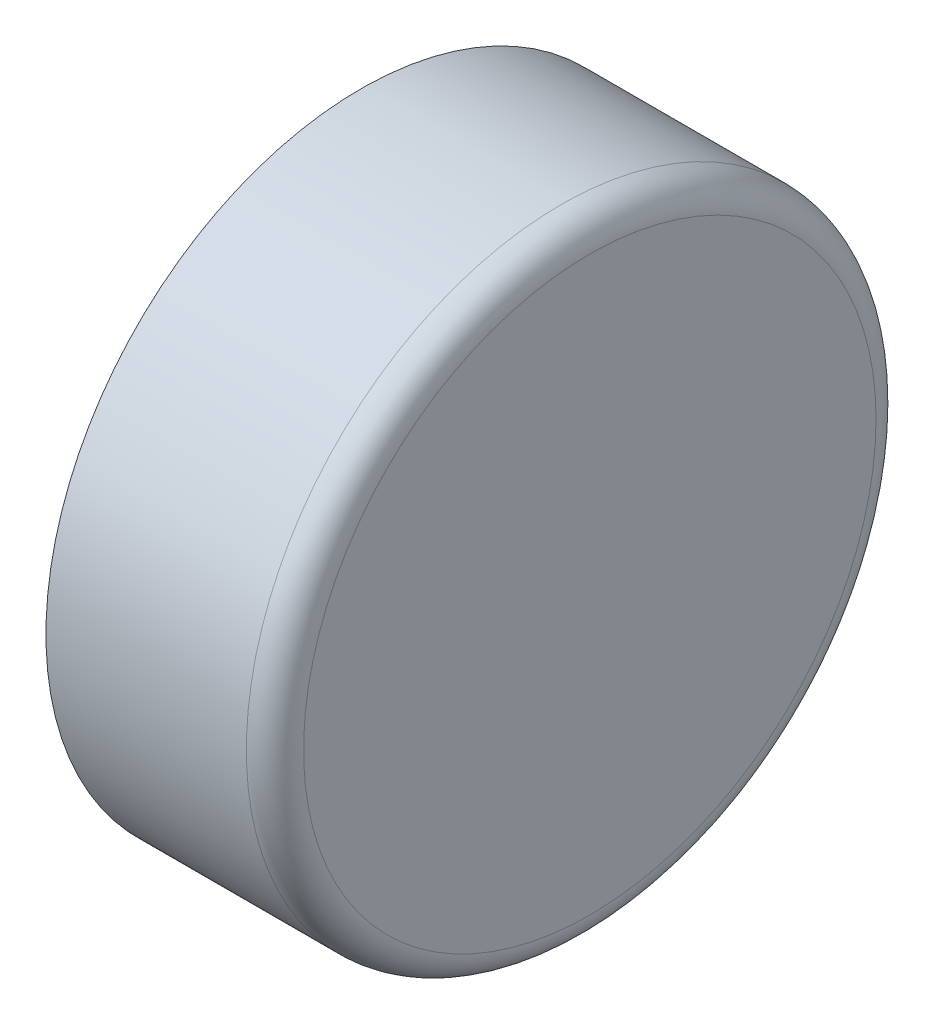
ISO-10303-21;
HEADER;
FILE_DESCRIPTION(('STEP AP214'),'2;1');
FILE_NAME('part.step','',(''),(''),'','','');
FILE_SCHEMA(('AUTOMOTIVE_DESIGN { 1 0 10303 214 1 1 1 1 }'));
ENDSEC;
DATA;
#1=APPLICATION_CONTEXT('core data for automotive mechanical design processes');
#2=APPLICATION_PROTOCOL_DEFINITION('international standard','automotive_design',2000,#1);
#3=PRODUCT_CONTEXT('',#1,'mechanical');
#4=PRODUCT('Part','Part','',(#3));
#5=PRODUCT_RELATED_PRODUCT_CATEGORY('part','',(#4));
#6=PRODUCT_DEFINITION_FORMATION('','',#4);
#7=PRODUCT_DEFINITION_CONTEXT('part definition',#1,'design');
#8=PRODUCT_DEFINITION('design','',#6,#7);
#9=PRODUCT_DEFINITION_SHAPE('','',#8);
#10=(LENGTH_UNIT() NAMED_UNIT(*) SI_UNIT(.MILLI.,.METRE.));
#11=(NAMED_UNIT(*) PLANE_ANGLE_UNIT() SI_UNIT($,.RADIAN.));
#12=(NAMED_UNIT(*) SI_UNIT($,.STERADIAN.) SOLID_ANGLE_UNIT());
#13=UNCERTAINTY_MEASURE_WITH_UNIT(LENGTH_MEASURE(1.E-05),#10,'distance_accuracy_value','');
#14=(GEOMETRIC_REPRESENTATION_CONTEXT(3) GLOBAL_UNCERTAINTY_ASSIGNED_CONTEXT((#13)) GLOBAL_UNIT_ASSIGNED_CONTEXT((#10,
#11,#12)) REPRESENTATION_CONTEXT('',''));
#15=CARTESIAN_POINT('',(0.,0.,0.));
#16=DIRECTION('',(0.,0.,1.));
#17=DIRECTION('',(1.,0.,0.));
#18=AXIS2_PLACEMENT_3D('',#15,#16,#17);
#19=CARTESIAN_POINT('',(8.,0.,0.));
#20=DIRECTION('',(-1.,0.,0.));
#21=DIRECTION('',(0.,0.,1.));
#22=AXIS2_PLACEMENT_3D('',#19,#20,#21);
#23=CYLINDRICAL_SURFACE('',#22,11.);
#24=CARTESIAN_POINT('',(7.,0.,0.));
#25=DIRECTION('',(1.,0.,0.));
#26=DIRECTION('',(0.,0.,-1.));
#27=AXIS2_PLACEMENT_3D('',#24,#25,#26);
#28=CIRCLE('',#27,11.);
#29=CARTESIAN_POINT('',(7.,0.,-11.));
#30=VERTEX_POINT('',#29);
#31=EDGE_CURVE('E11',#30,#30,#28,.F.);
#32=ORIENTED_EDGE('',*,*,#31,.T.);
#33=EDGE_LOOP('',(#32));
#34=FACE_BOUND('',#33,.T.);
#35=CARTESIAN_POINT('',(0.,0.,0.));
#36=DIRECTION('',(1.,0.,0.));
#37=DIRECTION('',(0.,0.,-1.));
#38=AXIS2_PLACEMENT_3D('',#35,#36,#37);
#39=CIRCLE('',#38,11.);
#40=CARTESIAN_POINT('',(0.,0.,-11.));
#41=VERTEX_POINT('',#40);
#42=EDGE_CURVE('E43',#41,#41,#39,.T.);
#43=ORIENTED_EDGE('',*,*,#42,.T.);
#44=EDGE_LOOP('',(#43));
#45=FACE_BOUND('',#44,.T.);
#46=ADVANCED_FACE('F32',(#34,#45),#23,.T.);
#47=CARTESIAN_POINT('',(8.,0.,0.));
#48=DIRECTION('',(1.,0.,0.));
#49=DIRECTION('',(0.,0.,-1.));
#50=AXIS2_PLACEMENT_3D('',#47,#48,#49);
#51=PLANE('',#50);
#52=CARTESIAN_POINT('',(8.,0.,0.));
#53=DIRECTION('',(1.,0.,0.));
#54=DIRECTION('',(0.,0.,-1.));
#55=AXIS2_PLACEMENT_3D('',#52,#53,#54);
#56=CIRCLE('',#55,10.);
#57=CARTESIAN_POINT('',(8.,0.,-10.));
#58=VERTEX_POINT('',#57);
#59=EDGE_CURVE('E39',#58,#58,#56,.T.);
#60=ORIENTED_EDGE('',*,*,#59,.T.);
#61=EDGE_LOOP('',(#60));
#62=FACE_BOUND('',#61,.T.);
#63=ADVANCED_FACE('F63',(#62),#51,.T.);
#64=CARTESIAN_POINT('',(0.,0.,0.));
#65=DIRECTION('',(1.,0.,0.));
#66=DIRECTION('',(0.,0.,-1.));
#67=AXIS2_PLACEMENT_3D('',#64,#65,#66);
#68=PLANE('',#67);
#69=CARTESIAN_POINT('',(0.,0.,0.));
#70=DIRECTION('',(-1.,0.,0.));
#71=DIRECTION('',(0.,0.,1.));
#72=AXIS2_PLACEMENT_3D('',#69,#70,#71);
#73=CIRCLE('',#72,3.);
#74=CARTESIAN_POINT('',(0.,0.,3.));
#75=VERTEX_POINT('',#74);
#76=EDGE_CURVE('E52',#75,#75,#73,.T.);
#77=ORIENTED_EDGE('',*,*,#76,.F.);
#78=EDGE_LOOP('',(#77));
#79=FACE_BOUND('',#78,.T.);
#80=ORIENTED_EDGE('',*,*,#42,.F.);
#81=EDGE_LOOP('',(#80));
#82=FACE_BOUND('',#81,.T.);
#83=ADVANCED_FACE('F59',(#79,#82),#68,.F.);
#84=CARTESIAN_POINT('',(7.,0.,0.));
#85=DIRECTION('',(1.,0.,0.));
#86=DIRECTION('',(0.,0.,-1.));
#87=AXIS2_PLACEMENT_3D('',#84,#85,#86);
#88=PLANE('',#87);
#89=CARTESIAN_POINT('',(7.,0.,0.));
#90=DIRECTION('',(1.,0.,0.));
#91=DIRECTION('',(0.,0.,-1.));
#92=AXIS2_PLACEMENT_3D('',#89,#90,#91);
#93=CIRCLE('',#92,3.);
#94=CARTESIAN_POINT('',(7.,0.,-3.));
#95=VERTEX_POINT('',#94);
#96=EDGE_CURVE('E47',#95,#95,#93,.F.);
#97=ORIENTED_EDGE('',*,*,#96,.T.);
#98=EDGE_LOOP('',(#97));
#99=FACE_BOUND('',#98,.T.);
#100=ADVANCED_FACE('F62',(#99),#88,.F.);
#101=CARTESIAN_POINT('',(16.4852813742386,0.,0.));
#102=DIRECTION('',(-1.,0.,0.));
#103=DIRECTION('',(0.,0.,1.));
#104=AXIS2_PLACEMENT_3D('',#101,#102,#103);
#105=CYLINDRICAL_SURFACE('',#104,3.);
#106=ORIENTED_EDGE('',*,*,#76,.T.);
#107=EDGE_LOOP('',(#106));
#108=FACE_BOUND('',#107,.T.);
#109=ORIENTED_EDGE('',*,*,#96,.F.);
#110=EDGE_LOOP('',(#109));
#111=FACE_BOUND('',#110,.T.);
#112=ADVANCED_FACE('F56',(#108,#111),#105,.F.);
#113=CARTESIAN_POINT('',(7.,0.,0.));
#114=DIRECTION('',(1.,0.,0.));
#115=DIRECTION('',(0.,0.,-1.));
#116=AXIS2_PLACEMENT_3D('',#113,#114,#115);
#117=TOROIDAL_SURFACE('',#116,10.,1.);
#118=ORIENTED_EDGE('',*,*,#31,.F.);
#119=EDGE_LOOP('',(#118));
#120=FACE_BOUND('',#119,.T.);
#121=ORIENTED_EDGE('',*,*,#59,.F.);
#122=EDGE_LOOP('',(#121));
#123=FACE_BOUND('',#122,.T.);
#124=ADVANCED_FACE('F34',(#120,#123),#117,.T.);
#125=CLOSED_SHELL('',(#46,#63,#83,#100,#112,#124));
#126=MANIFOLD_SOLID_BREP('B2',#125);
#127=ADVANCED_BREP_SHAPE_REPRESENTATION('',(#18,#126),#14);
#128=SHAPE_DEFINITION_REPRESENTATION(#9,#127);
ENDSEC;
END-ISO-10303-21;
